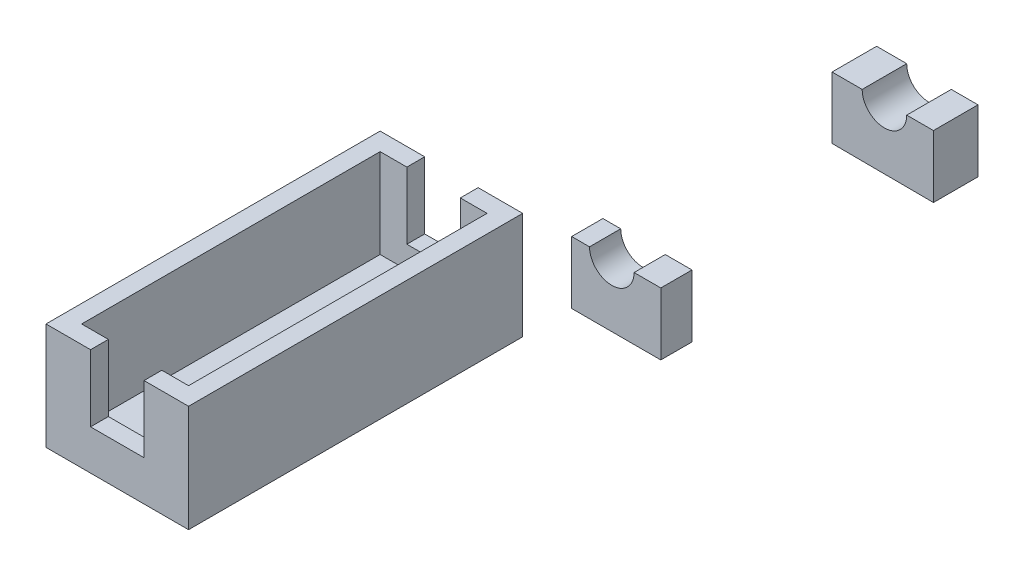
ISO-10303-21;
HEADER;
FILE_DESCRIPTION(('STEP AP214'),'2;1');
FILE_NAME('part.step','',(''),(''),'','','');
FILE_SCHEMA(('AUTOMOTIVE_DESIGN { 1 0 10303 214 1 1 1 1 }'));
ENDSEC;
DATA;
#1=APPLICATION_CONTEXT('core data for automotive mechanical design processes');
#2=APPLICATION_PROTOCOL_DEFINITION('international standard','automotive_design',2000,#1);
#3=PRODUCT_CONTEXT('',#1,'mechanical');
#4=PRODUCT('Part','Part','',(#3));
#5=PRODUCT_RELATED_PRODUCT_CATEGORY('part','',(#4));
#6=PRODUCT_DEFINITION_FORMATION('','',#4);
#7=PRODUCT_DEFINITION_CONTEXT('part definition',#1,'design');
#8=PRODUCT_DEFINITION('design','',#6,#7);
#9=PRODUCT_DEFINITION_SHAPE('','',#8);
#10=(LENGTH_UNIT() NAMED_UNIT(*) SI_UNIT(.MILLI.,.METRE.));
#11=(NAMED_UNIT(*) PLANE_ANGLE_UNIT() SI_UNIT($,.RADIAN.));
#12=(NAMED_UNIT(*) SI_UNIT($,.STERADIAN.) SOLID_ANGLE_UNIT());
#13=UNCERTAINTY_MEASURE_WITH_UNIT(LENGTH_MEASURE(1.E-05),#10,'distance_accuracy_value','');
#14=(GEOMETRIC_REPRESENTATION_CONTEXT(3) GLOBAL_UNCERTAINTY_ASSIGNED_CONTEXT((#13)) GLOBAL_UNIT_ASSIGNED_CONTEXT((#10,
#11,#12)) REPRESENTATION_CONTEXT('',''));
#15=CARTESIAN_POINT('',(0.,0.,0.));
#16=DIRECTION('',(0.,0.,1.));
#17=DIRECTION('',(1.,0.,0.));
#18=AXIS2_PLACEMENT_3D('',#15,#16,#17);
#19=CARTESIAN_POINT('',(0.,0.,-43.1));
#20=DIRECTION('',(0.,-1.,0.));
#21=DIRECTION('',(1.,0.,0.));
#22=AXIS2_PLACEMENT_3D('',#19,#20,#21);
#23=PLANE('',#22);
#24=DIRECTION('',(1.,0.,0.));
#25=VECTOR('',#24,1.);
#26=CARTESIAN_POINT('',(0.,0.,-38.1));
#27=LINE('',#26,#25);
#28=CARTESIAN_POINT('',(6.62077279727074,0.,-38.1));
#29=VERTEX_POINT('',#28);
#30=CARTESIAN_POINT('',(9.99999999999987,0.,-38.1));
#31=VERTEX_POINT('',#30);
#32=EDGE_CURVE('E130',#29,#31,#27,.T.);
#33=ORIENTED_EDGE('',*,*,#32,.T.);
#34=DIRECTION('',(0.,0.,1.));
#35=VECTOR('',#34,1.);
#36=CARTESIAN_POINT('',(9.99999999999987,0.,-43.1));
#37=LINE('',#36,#35);
#38=CARTESIAN_POINT('',(9.99999999999987,0.,-43.1));
#39=VERTEX_POINT('',#38);
#40=EDGE_CURVE('E12',#39,#31,#37,.T.);
#41=ORIENTED_EDGE('',*,*,#40,.F.);
#42=DIRECTION('',(1.,0.,0.));
#43=VECTOR('',#42,1.);
#44=CARTESIAN_POINT('',(0.,0.,-43.1));
#45=LINE('',#44,#43);
#46=CARTESIAN_POINT('',(6.62077279727074,0.,-43.1));
#47=VERTEX_POINT('',#46);
#48=EDGE_CURVE('E140',#47,#39,#45,.T.);
#49=ORIENTED_EDGE('',*,*,#48,.F.);
#50=DIRECTION('',(0.,0.,1.));
#51=VECTOR('',#50,1.);
#52=CARTESIAN_POINT('',(6.62077279727074,0.,-43.1));
#53=LINE('',#52,#51);
#54=EDGE_CURVE('E126',#47,#29,#53,.T.);
#55=ORIENTED_EDGE('',*,*,#54,.T.);
#56=EDGE_LOOP('',(#33,#41,#49,#55));
#57=FACE_BOUND('',#56,.T.);
#58=ADVANCED_FACE('F46',(#57),#23,.F.);
#59=CARTESIAN_POINT('',(12.4999999999953,1.20736753927986E-12,-43.1));
#60=DIRECTION('',(0.,0.,1.));
#61=DIRECTION('',(1.,0.,0.));
#62=AXIS2_PLACEMENT_3D('',#59,#60,#61);
#63=CYLINDRICAL_SURFACE('',#62,2.50000000000007);
#64=CARTESIAN_POINT('',(12.4999999999953,1.20736753927986E-12,-38.1));
#65=DIRECTION('',(0.,0.,-1.));
#66=DIRECTION('',(-1.,0.,0.));
#67=AXIS2_PLACEMENT_3D('',#64,#65,#66);
#68=CIRCLE('',#67,2.50000000000007);
#69=CARTESIAN_POINT('',(15.,0.,-38.1));
#70=VERTEX_POINT('',#69);
#71=EDGE_CURVE('E133',#31,#70,#68,.F.);
#72=ORIENTED_EDGE('',*,*,#71,.T.);
#73=DIRECTION('',(0.,0.,1.));
#74=VECTOR('',#73,1.);
#75=CARTESIAN_POINT('',(15.,0.,-43.1));
#76=LINE('',#75,#74);
#77=CARTESIAN_POINT('',(15.,0.,-43.1));
#78=VERTEX_POINT('',#77);
#79=EDGE_CURVE('E54',#78,#70,#76,.T.);
#80=ORIENTED_EDGE('',*,*,#79,.F.);
#81=CARTESIAN_POINT('',(12.4999999999953,1.20736753927986E-12,-43.1));
#82=DIRECTION('',(0.,0.,-1.));
#83=DIRECTION('',(-1.,0.,0.));
#84=AXIS2_PLACEMENT_3D('',#81,#82,#83);
#85=CIRCLE('',#84,2.50000000000007);
#86=EDGE_CURVE('E99',#39,#78,#85,.F.);
#87=ORIENTED_EDGE('',*,*,#86,.F.);
#88=ORIENTED_EDGE('',*,*,#40,.T.);
#89=EDGE_LOOP('',(#72,#80,#87,#88));
#90=FACE_BOUND('',#89,.T.);
#91=ADVANCED_FACE('F164',(#90),#63,.F.);
#92=CARTESIAN_POINT('',(0.,0.,-43.1));
#93=DIRECTION('',(0.,-1.,0.));
#94=DIRECTION('',(1.,0.,0.));
#95=AXIS2_PLACEMENT_3D('',#92,#93,#94);
#96=PLANE('',#95);
#97=DIRECTION('',(1.,0.,0.));
#98=VECTOR('',#97,1.);
#99=CARTESIAN_POINT('',(0.,0.,-38.1));
#100=LINE('',#99,#98);
#101=CARTESIAN_POINT('',(18.,0.,-38.1));
#102=VERTEX_POINT('',#101);
#103=EDGE_CURVE('E135',#70,#102,#100,.T.);
#104=ORIENTED_EDGE('',*,*,#103,.T.);
#105=DIRECTION('',(0.,0.,1.));
#106=VECTOR('',#105,1.);
#107=CARTESIAN_POINT('',(18.,0.,-43.1));
#108=LINE('',#107,#106);
#109=CARTESIAN_POINT('',(18.,0.,-43.1));
#110=VERTEX_POINT('',#109);
#111=EDGE_CURVE('E121',#110,#102,#108,.T.);
#112=ORIENTED_EDGE('',*,*,#111,.F.);
#113=DIRECTION('',(1.,0.,0.));
#114=VECTOR('',#113,1.);
#115=CARTESIAN_POINT('',(0.,0.,-43.1));
#116=LINE('',#115,#114);
#117=EDGE_CURVE('E112',#78,#110,#116,.T.);
#118=ORIENTED_EDGE('',*,*,#117,.F.);
#119=ORIENTED_EDGE('',*,*,#79,.T.);
#120=EDGE_LOOP('',(#104,#112,#118,#119));
#121=FACE_BOUND('',#120,.T.);
#122=ADVANCED_FACE('F146',(#121),#96,.F.);
#123=CARTESIAN_POINT('',(18.,0.,-43.1));
#124=DIRECTION('',(-1.,0.,0.));
#125=DIRECTION('',(0.,0.,1.));
#126=AXIS2_PLACEMENT_3D('',#123,#124,#125);
#127=PLANE('',#126);
#128=DIRECTION('',(0.,-1.,0.));
#129=VECTOR('',#128,1.);
#130=CARTESIAN_POINT('',(18.,0.,-38.1));
#131=LINE('',#130,#129);
#132=CARTESIAN_POINT('',(18.,-7.,-38.1));
#133=VERTEX_POINT('',#132);
#134=EDGE_CURVE('E120',#102,#133,#131,.T.);
#135=ORIENTED_EDGE('',*,*,#134,.T.);
#136=DIRECTION('',(0.,0.,1.));
#137=VECTOR('',#136,1.);
#138=CARTESIAN_POINT('',(18.,-7.,-43.1));
#139=LINE('',#138,#137);
#140=CARTESIAN_POINT('',(18.,-7.,-43.1));
#141=VERTEX_POINT('',#140);
#142=EDGE_CURVE('E117',#141,#133,#139,.T.);
#143=ORIENTED_EDGE('',*,*,#142,.F.);
#144=DIRECTION('',(0.,-1.,0.));
#145=VECTOR('',#144,1.);
#146=CARTESIAN_POINT('',(18.,0.,-43.1));
#147=LINE('',#146,#145);
#148=EDGE_CURVE('E106',#110,#141,#147,.T.);
#149=ORIENTED_EDGE('',*,*,#148,.F.);
#150=ORIENTED_EDGE('',*,*,#111,.T.);
#151=EDGE_LOOP('',(#135,#143,#149,#150));
#152=FACE_BOUND('',#151,.T.);
#153=ADVANCED_FACE('F118',(#152),#127,.F.);
#154=CARTESIAN_POINT('',(-0.0329085951559683,-6.91417080878468,-43.1));
#155=DIRECTION('',(0.00475953275125083,0.999988673359849,0.));
#156=DIRECTION('',(-0.999988673359849,0.00475953275125083,0.));
#157=AXIS2_PLACEMENT_3D('',#154,#155,#156);
#158=PLANE('',#157);
#159=DIRECTION('',(-0.999988673359849,0.00475953275125083,0.));
#160=VECTOR('',#159,1.);
#161=CARTESIAN_POINT('',(-0.0329085951559683,-6.91417080878468,-38.1));
#162=LINE('',#161,#160);
#163=CARTESIAN_POINT('',(6.62077279727074,-6.94583958198912,-38.1));
#164=VERTEX_POINT('',#163);
#165=EDGE_CURVE('E85',#133,#164,#162,.T.);
#166=ORIENTED_EDGE('',*,*,#165,.T.);
#167=DIRECTION('',(0.,0.,1.));
#168=VECTOR('',#167,1.);
#169=CARTESIAN_POINT('',(6.62077279727074,-6.94583958198912,-43.1));
#170=LINE('',#169,#168);
#171=CARTESIAN_POINT('',(6.62077279727074,-6.94583958198912,-43.1));
#172=VERTEX_POINT('',#171);
#173=EDGE_CURVE('E122',#172,#164,#170,.T.);
#174=ORIENTED_EDGE('',*,*,#173,.F.);
#175=DIRECTION('',(-0.999988673359849,0.00475953275125083,0.));
#176=VECTOR('',#175,1.);
#177=CARTESIAN_POINT('',(-0.0329085951559683,-6.91417080878468,-43.1));
#178=LINE('',#177,#176);
#179=EDGE_CURVE('E110',#141,#172,#178,.T.);
#180=ORIENTED_EDGE('',*,*,#179,.F.);
#181=ORIENTED_EDGE('',*,*,#142,.T.);
#182=EDGE_LOOP('',(#166,#174,#180,#181));
#183=FACE_BOUND('',#182,.T.);
#184=ADVANCED_FACE('F124',(#183),#158,.F.);
#185=CARTESIAN_POINT('',(6.62077279727074,0.,-43.1));
#186=DIRECTION('',(1.,0.,0.));
#187=DIRECTION('',(0.,0.,-1.));
#188=AXIS2_PLACEMENT_3D('',#185,#186,#187);
#189=PLANE('',#188);
#190=DIRECTION('',(0.,1.,0.));
#191=VECTOR('',#190,1.);
#192=CARTESIAN_POINT('',(6.62077279727074,0.,-38.1));
#193=LINE('',#192,#191);
#194=EDGE_CURVE('E91',#164,#29,#193,.T.);
#195=ORIENTED_EDGE('',*,*,#194,.T.);
#196=ORIENTED_EDGE('',*,*,#54,.F.);
#197=DIRECTION('',(0.,1.,0.));
#198=VECTOR('',#197,1.);
#199=CARTESIAN_POINT('',(6.62077279727074,0.,-43.1));
#200=LINE('',#199,#198);
#201=EDGE_CURVE('E62',#172,#47,#200,.T.);
#202=ORIENTED_EDGE('',*,*,#201,.F.);
#203=ORIENTED_EDGE('',*,*,#173,.T.);
#204=EDGE_LOOP('',(#195,#196,#202,#203));
#205=FACE_BOUND('',#204,.T.);
#206=ADVANCED_FACE('F153',(#205),#189,.F.);
#207=CARTESIAN_POINT('',(0.,0.,-43.1));
#208=DIRECTION('',(0.,0.,-1.));
#209=DIRECTION('',(-1.,0.,0.));
#210=AXIS2_PLACEMENT_3D('',#207,#208,#209);
#211=PLANE('',#210);
#212=ORIENTED_EDGE('',*,*,#48,.T.);
#213=ORIENTED_EDGE('',*,*,#86,.T.);
#214=ORIENTED_EDGE('',*,*,#117,.T.);
#215=ORIENTED_EDGE('',*,*,#148,.T.);
#216=ORIENTED_EDGE('',*,*,#179,.T.);
#217=ORIENTED_EDGE('',*,*,#201,.T.);
#218=EDGE_LOOP('',(#212,#213,#214,#215,#216,#217));
#219=FACE_BOUND('',#218,.T.);
#220=ADVANCED_FACE('F108',(#219),#211,.T.);
#221=CARTESIAN_POINT('',(0.,0.,-38.1));
#222=DIRECTION('',(0.,0.,-1.));
#223=DIRECTION('',(-1.,0.,0.));
#224=AXIS2_PLACEMENT_3D('',#221,#222,#223);
#225=PLANE('',#224);
#226=ORIENTED_EDGE('',*,*,#32,.F.);
#227=ORIENTED_EDGE('',*,*,#194,.F.);
#228=ORIENTED_EDGE('',*,*,#165,.F.);
#229=ORIENTED_EDGE('',*,*,#134,.F.);
#230=ORIENTED_EDGE('',*,*,#103,.F.);
#231=ORIENTED_EDGE('',*,*,#71,.F.);
#232=EDGE_LOOP('',(#226,#227,#228,#229,#230,#231));
#233=FACE_BOUND('',#232,.T.);
#234=ADVANCED_FACE('F149',(#233),#225,.F.);
#235=CLOSED_SHELL('',(#58,#91,#122,#153,#184,#206,#220,#234));
#236=MANIFOLD_SOLID_BREP('B2',#235);
#237=CARTESIAN_POINT('',(0.,0.,-11.));
#238=DIRECTION('',(0.,1.,0.));
#239=DIRECTION('',(-1.,0.,0.));
#240=AXIS2_PLACEMENT_3D('',#237,#238,#239);
#241=PLANE('',#240);
#242=DIRECTION('',(-1.,0.,0.));
#243=VECTOR('',#242,1.);
#244=CARTESIAN_POINT('',(0.,0.,-7.5));
#245=LINE('',#244,#243);
#246=CARTESIAN_POINT('',(10.,0.,-7.5));
#247=VERTEX_POINT('',#246);
#248=CARTESIAN_POINT('',(8.,0.,-7.5));
#249=VERTEX_POINT('',#248);
#250=EDGE_CURVE('E313',#247,#249,#245,.T.);
#251=ORIENTED_EDGE('',*,*,#250,.F.);
#252=DIRECTION('',(0.,0.,1.));
#253=VECTOR('',#252,1.);
#254=CARTESIAN_POINT('',(10.,0.,-11.));
#255=LINE('',#254,#253);
#256=CARTESIAN_POINT('',(10.,0.,-11.));
#257=VERTEX_POINT('',#256);
#258=EDGE_CURVE('E44',#257,#247,#255,.T.);
#259=ORIENTED_EDGE('',*,*,#258,.F.);
#260=DIRECTION('',(-1.,0.,0.));
#261=VECTOR('',#260,1.);
#262=CARTESIAN_POINT('',(0.,0.,-11.));
#263=LINE('',#262,#261);
#264=CARTESIAN_POINT('',(8.,0.,-11.));
#265=VERTEX_POINT('',#264);
#266=EDGE_CURVE('E325',#257,#265,#263,.T.);
#267=ORIENTED_EDGE('',*,*,#266,.T.);
#268=DIRECTION('',(0.,0.,1.));
#269=VECTOR('',#268,1.);
#270=CARTESIAN_POINT('',(8.,0.,-11.));
#271=LINE('',#270,#269);
#272=EDGE_CURVE('E247',#265,#249,#271,.T.);
#273=ORIENTED_EDGE('',*,*,#272,.T.);
#274=EDGE_LOOP('',(#251,#259,#267,#273));
#275=FACE_BOUND('',#274,.T.);
#276=ADVANCED_FACE('F231',(#275),#241,.T.);
#277=CARTESIAN_POINT('',(12.5,0.,-11.));
#278=DIRECTION('',(0.,0.,1.));
#279=DIRECTION('',(1.,0.,0.));
#280=AXIS2_PLACEMENT_3D('',#277,#278,#279);
#281=CYLINDRICAL_SURFACE('',#280,2.5);
#282=CARTESIAN_POINT('',(12.5,0.,-7.5));
#283=DIRECTION('',(0.,0.,-1.));
#284=DIRECTION('',(-1.,0.,0.));
#285=AXIS2_PLACEMENT_3D('',#282,#283,#284);
#286=CIRCLE('',#285,2.5);
#287=CARTESIAN_POINT('',(15.,0.,-7.5));
#288=VERTEX_POINT('',#287);
#289=EDGE_CURVE('E315',#247,#288,#286,.F.);
#290=ORIENTED_EDGE('',*,*,#289,.T.);
#291=DIRECTION('',(0.,0.,1.));
#292=VECTOR('',#291,1.);
#293=CARTESIAN_POINT('',(15.,0.,-11.));
#294=LINE('',#293,#292);
#295=CARTESIAN_POINT('',(15.,0.,-11.));
#296=VERTEX_POINT('',#295);
#297=EDGE_CURVE('E239',#296,#288,#294,.T.);
#298=ORIENTED_EDGE('',*,*,#297,.F.);
#299=CARTESIAN_POINT('',(12.5,0.,-11.));
#300=DIRECTION('',(0.,0.,-1.));
#301=DIRECTION('',(-1.,0.,0.));
#302=AXIS2_PLACEMENT_3D('',#299,#300,#301);
#303=CIRCLE('',#302,2.5);
#304=EDGE_CURVE('E401',#257,#296,#303,.F.);
#305=ORIENTED_EDGE('',*,*,#304,.F.);
#306=ORIENTED_EDGE('',*,*,#258,.T.);
#307=EDGE_LOOP('',(#290,#298,#305,#306));
#308=FACE_BOUND('',#307,.T.);
#309=ADVANCED_FACE('F348',(#308),#281,.F.);
#310=CARTESIAN_POINT('',(0.,0.,-11.));
#311=DIRECTION('',(0.,-1.,0.));
#312=DIRECTION('',(1.,0.,0.));
#313=AXIS2_PLACEMENT_3D('',#310,#311,#312);
#314=PLANE('',#313);
#315=DIRECTION('',(1.,0.,0.));
#316=VECTOR('',#315,1.);
#317=CARTESIAN_POINT('',(0.,0.,-7.5));
#318=LINE('',#317,#316);
#319=CARTESIAN_POINT('',(18.,0.,-7.5));
#320=VERTEX_POINT('',#319);
#321=EDGE_CURVE('E317',#288,#320,#318,.T.);
#322=ORIENTED_EDGE('',*,*,#321,.T.);
#323=DIRECTION('',(0.,0.,1.));
#324=VECTOR('',#323,1.);
#325=CARTESIAN_POINT('',(18.,0.,-11.));
#326=LINE('',#325,#324);
#327=CARTESIAN_POINT('',(18.,0.,-11.));
#328=VERTEX_POINT('',#327);
#329=EDGE_CURVE('E305',#328,#320,#326,.T.);
#330=ORIENTED_EDGE('',*,*,#329,.F.);
#331=DIRECTION('',(1.,0.,0.));
#332=VECTOR('',#331,1.);
#333=CARTESIAN_POINT('',(0.,0.,-11.));
#334=LINE('',#333,#332);
#335=EDGE_CURVE('E293',#296,#328,#334,.T.);
#336=ORIENTED_EDGE('',*,*,#335,.F.);
#337=ORIENTED_EDGE('',*,*,#297,.T.);
#338=EDGE_LOOP('',(#322,#330,#336,#337));
#339=FACE_BOUND('',#338,.T.);
#340=ADVANCED_FACE('F332',(#339),#314,.F.);
#341=CARTESIAN_POINT('',(18.,0.,-11.));
#342=DIRECTION('',(-1.,0.,0.));
#343=DIRECTION('',(0.,0.,1.));
#344=AXIS2_PLACEMENT_3D('',#341,#342,#343);
#345=PLANE('',#344);
#346=DIRECTION('',(0.,-1.,0.));
#347=VECTOR('',#346,1.);
#348=CARTESIAN_POINT('',(18.,0.,-7.5));
#349=LINE('',#348,#347);
#350=CARTESIAN_POINT('',(18.,-7.,-7.5));
#351=VERTEX_POINT('',#350);
#352=EDGE_CURVE('E302',#320,#351,#349,.T.);
#353=ORIENTED_EDGE('',*,*,#352,.T.);
#354=DIRECTION('',(0.,0.,1.));
#355=VECTOR('',#354,1.);
#356=CARTESIAN_POINT('',(18.,-7.,-11.));
#357=LINE('',#356,#355);
#358=CARTESIAN_POINT('',(18.,-7.,-11.));
#359=VERTEX_POINT('',#358);
#360=EDGE_CURVE('E299',#359,#351,#357,.T.);
#361=ORIENTED_EDGE('',*,*,#360,.F.);
#362=DIRECTION('',(0.,-1.,0.));
#363=VECTOR('',#362,1.);
#364=CARTESIAN_POINT('',(18.,0.,-11.));
#365=LINE('',#364,#363);
#366=EDGE_CURVE('E285',#328,#359,#365,.T.);
#367=ORIENTED_EDGE('',*,*,#366,.F.);
#368=ORIENTED_EDGE('',*,*,#329,.T.);
#369=EDGE_LOOP('',(#353,#361,#367,#368));
#370=FACE_BOUND('',#369,.T.);
#371=ADVANCED_FACE('F300',(#370),#345,.F.);
#372=CARTESIAN_POINT('',(0.,-7.,-11.));
#373=DIRECTION('',(0.,1.,0.));
#374=DIRECTION('',(0.,0.,1.));
#375=AXIS2_PLACEMENT_3D('',#372,#373,#374);
#376=PLANE('',#375);
#377=DIRECTION('',(-1.,0.,0.));
#378=VECTOR('',#377,1.);
#379=CARTESIAN_POINT('',(0.,-7.,-7.5));
#380=LINE('',#379,#378);
#381=CARTESIAN_POINT('',(8.,-7.,-7.5));
#382=VERTEX_POINT('',#381);
#383=EDGE_CURVE('E320',#351,#382,#380,.T.);
#384=ORIENTED_EDGE('',*,*,#383,.T.);
#385=DIRECTION('',(0.,0.,1.));
#386=VECTOR('',#385,1.);
#387=CARTESIAN_POINT('',(8.,-7.,-11.));
#388=LINE('',#387,#386);
#389=CARTESIAN_POINT('',(8.,-7.,-11.));
#390=VERTEX_POINT('',#389);
#391=EDGE_CURVE('E267',#390,#382,#388,.T.);
#392=ORIENTED_EDGE('',*,*,#391,.F.);
#393=DIRECTION('',(-1.,0.,0.));
#394=VECTOR('',#393,1.);
#395=CARTESIAN_POINT('',(0.,-7.,-11.));
#396=LINE('',#395,#394);
#397=EDGE_CURVE('E291',#359,#390,#396,.T.);
#398=ORIENTED_EDGE('',*,*,#397,.F.);
#399=ORIENTED_EDGE('',*,*,#360,.T.);
#400=EDGE_LOOP('',(#384,#392,#398,#399));
#401=FACE_BOUND('',#400,.T.);
#402=ADVANCED_FACE('F307',(#401),#376,.F.);
#403=CARTESIAN_POINT('',(8.,0.,-11.));
#404=DIRECTION('',(-1.,0.,0.));
#405=DIRECTION('',(0.,-1.,0.));
#406=AXIS2_PLACEMENT_3D('',#403,#404,#405);
#407=PLANE('',#406);
#408=DIRECTION('',(0.,-1.,0.));
#409=VECTOR('',#408,1.);
#410=CARTESIAN_POINT('',(8.,0.,-7.5));
#411=LINE('',#410,#409);
#412=EDGE_CURVE('E322',#249,#382,#411,.T.);
#413=ORIENTED_EDGE('',*,*,#412,.F.);
#414=ORIENTED_EDGE('',*,*,#272,.F.);
#415=DIRECTION('',(0.,-1.,0.));
#416=VECTOR('',#415,1.);
#417=CARTESIAN_POINT('',(8.,0.,-11.));
#418=LINE('',#417,#416);
#419=EDGE_CURVE('E308',#265,#390,#418,.T.);
#420=ORIENTED_EDGE('',*,*,#419,.T.);
#421=ORIENTED_EDGE('',*,*,#391,.T.);
#422=EDGE_LOOP('',(#413,#414,#420,#421));
#423=FACE_BOUND('',#422,.T.);
#424=ADVANCED_FACE('F337',(#423),#407,.T.);
#425=CARTESIAN_POINT('',(0.,0.,-11.));
#426=DIRECTION('',(0.,0.,-1.));
#427=DIRECTION('',(-1.,0.,0.));
#428=AXIS2_PLACEMENT_3D('',#425,#426,#427);
#429=PLANE('',#428);
#430=ORIENTED_EDGE('',*,*,#266,.F.);
#431=ORIENTED_EDGE('',*,*,#304,.T.);
#432=ORIENTED_EDGE('',*,*,#335,.T.);
#433=ORIENTED_EDGE('',*,*,#366,.T.);
#434=ORIENTED_EDGE('',*,*,#397,.T.);
#435=ORIENTED_EDGE('',*,*,#419,.F.);
#436=EDGE_LOOP('',(#430,#431,#432,#433,#434,#435));
#437=FACE_BOUND('',#436,.T.);
#438=ADVANCED_FACE('F288',(#437),#429,.T.);
#439=CARTESIAN_POINT('',(0.,0.,-7.5));
#440=DIRECTION('',(0.,0.,-1.));
#441=DIRECTION('',(-1.,0.,0.));
#442=AXIS2_PLACEMENT_3D('',#439,#440,#441);
#443=PLANE('',#442);
#444=ORIENTED_EDGE('',*,*,#250,.T.);
#445=ORIENTED_EDGE('',*,*,#412,.T.);
#446=ORIENTED_EDGE('',*,*,#383,.F.);
#447=ORIENTED_EDGE('',*,*,#352,.F.);
#448=ORIENTED_EDGE('',*,*,#321,.F.);
#449=ORIENTED_EDGE('',*,*,#289,.F.);
#450=EDGE_LOOP('',(#444,#445,#446,#447,#448,#449));
#451=FACE_BOUND('',#450,.T.);
#452=ADVANCED_FACE('F336',(#451),#443,.F.);
#453=CLOSED_SHELL('',(#276,#309,#340,#371,#402,#424,#438,#452));
#454=MANIFOLD_SOLID_BREP('B6',#453);
#455=CARTESIAN_POINT('',(-6.,0.,33.5));
#456=DIRECTION('',(1.,0.,0.));
#457=DIRECTION('',(0.,0.,-1.));
#458=AXIS2_PLACEMENT_3D('',#455,#456,#457);
#459=PLANE('',#458);
#460=DIRECTION('',(0.,-1.,0.));
#461=VECTOR('',#460,1.);
#462=CARTESIAN_POINT('',(-6.,0.,0.));
#463=LINE('',#462,#461);
#464=CARTESIAN_POINT('',(-6.,5.,0.));
#465=VERTEX_POINT('',#464);
#466=CARTESIAN_POINT('',(-6.,-5.,0.));
#467=VERTEX_POINT('',#466);
#468=EDGE_CURVE('E591',#465,#467,#463,.T.);
#469=ORIENTED_EDGE('',*,*,#468,.F.);
#470=DIRECTION('',(0.,0.,-1.));
#471=VECTOR('',#470,1.);
#472=CARTESIAN_POINT('',(-6.,5.,33.5));
#473=LINE('',#472,#471);
#474=CARTESIAN_POINT('',(-6.,5.,33.5));
#475=VERTEX_POINT('',#474);
#476=EDGE_CURVE('E229',#475,#465,#473,.T.);
#477=ORIENTED_EDGE('',*,*,#476,.F.);
#478=DIRECTION('',(0.,-1.,0.));
#479=VECTOR('',#478,1.);
#480=CARTESIAN_POINT('',(-6.,0.,33.5));
#481=LINE('',#480,#479);
#482=CARTESIAN_POINT('',(-6.,-5.,33.5));
#483=VERTEX_POINT('',#482);
#484=EDGE_CURVE('E599',#475,#483,#481,.T.);
#485=ORIENTED_EDGE('',*,*,#484,.T.);
#486=DIRECTION('',(0.,0.,-1.));
#487=VECTOR('',#486,1.);
#488=CARTESIAN_POINT('',(-6.,-5.,33.5));
#489=LINE('',#488,#487);
#490=EDGE_CURVE('E439',#483,#467,#489,.T.);
#491=ORIENTED_EDGE('',*,*,#490,.T.);
#492=EDGE_LOOP('',(#469,#477,#485,#491));
#493=FACE_BOUND('',#492,.T.);
#494=ADVANCED_FACE('F406',(#493),#459,.T.);
#495=CARTESIAN_POINT('',(0.,5.,33.5));
#496=DIRECTION('',(0.,1.,0.));
#497=DIRECTION('',(0.,0.,1.));
#498=AXIS2_PLACEMENT_3D('',#495,#496,#497);
#499=PLANE('',#498);
#500=ORIENTED_EDGE('',*,*,#476,.T.);
#501=DIRECTION('',(-1.,0.,0.));
#502=VECTOR('',#501,1.);
#503=CARTESIAN_POINT('',(0.,5.,0.));
#504=LINE('',#503,#502);
#505=CARTESIAN_POINT('',(-3.,5.,0.));
#506=VERTEX_POINT('',#505);
#507=EDGE_CURVE('E548',#506,#465,#504,.T.);
#508=ORIENTED_EDGE('',*,*,#507,.F.);
#509=DIRECTION('',(0.,0.,1.));
#510=VECTOR('',#509,1.);
#511=CARTESIAN_POINT('',(-3.,5.,-2.));
#512=LINE('',#511,#510);
#513=CARTESIAN_POINT('',(-3.,5.,-2.));
#514=VERTEX_POINT('',#513);
#515=EDGE_CURVE('E589',#514,#506,#512,.T.);
#516=ORIENTED_EDGE('',*,*,#515,.F.);
#517=DIRECTION('',(-1.,0.,0.));
#518=VECTOR('',#517,1.);
#519=CARTESIAN_POINT('',(0.,5.,-2.));
#520=LINE('',#519,#518);
#521=CARTESIAN_POINT('',(-8.,5.,-2.));
#522=VERTEX_POINT('',#521);
#523=EDGE_CURVE('E557',#514,#522,#520,.T.);
#524=ORIENTED_EDGE('',*,*,#523,.T.);
#525=DIRECTION('',(0.,0.,-1.));
#526=VECTOR('',#525,1.);
#527=CARTESIAN_POINT('',(-8.,5.,33.5));
#528=LINE('',#527,#526);
#529=CARTESIAN_POINT('',(-8.,5.,35.5));
#530=VERTEX_POINT('',#529);
#531=EDGE_CURVE('E414',#530,#522,#528,.T.);
#532=ORIENTED_EDGE('',*,*,#531,.F.);
#533=DIRECTION('',(1.,0.,0.));
#534=VECTOR('',#533,1.);
#535=CARTESIAN_POINT('',(0.,5.,35.5));
#536=LINE('',#535,#534);
#537=CARTESIAN_POINT('',(-3.,5.,35.5));
#538=VERTEX_POINT('',#537);
#539=EDGE_CURVE('E667',#530,#538,#536,.T.);
#540=ORIENTED_EDGE('',*,*,#539,.T.);
#541=DIRECTION('',(0.,0.,-1.));
#542=VECTOR('',#541,1.);
#543=CARTESIAN_POINT('',(-3.,5.,35.5));
#544=LINE('',#543,#542);
#545=CARTESIAN_POINT('',(-3.,5.,33.5));
#546=VERTEX_POINT('',#545);
#547=EDGE_CURVE('E553',#538,#546,#544,.T.);
#548=ORIENTED_EDGE('',*,*,#547,.T.);
#549=DIRECTION('',(1.,0.,0.));
#550=VECTOR('',#549,1.);
#551=CARTESIAN_POINT('',(0.,5.,33.5));
#552=LINE('',#551,#550);
#553=EDGE_CURVE('E679',#475,#546,#552,.T.);
#554=ORIENTED_EDGE('',*,*,#553,.F.);
#555=EDGE_LOOP('',(#500,#508,#516,#524,#532,#540,#548,#554));
#556=FACE_BOUND('',#555,.T.);
#557=ADVANCED_FACE('F636',(#556),#499,.T.);
#558=CARTESIAN_POINT('',(-8.,0.,33.5));
#559=DIRECTION('',(-1.,0.,0.));
#560=DIRECTION('',(0.,0.,1.));
#561=AXIS2_PLACEMENT_3D('',#558,#559,#560);
#562=PLANE('',#561);
#563=ORIENTED_EDGE('',*,*,#531,.T.);
#564=DIRECTION('',(0.,1.,0.));
#565=VECTOR('',#564,1.);
#566=CARTESIAN_POINT('',(-8.,0.,-2.));
#567=LINE('',#566,#565);
#568=CARTESIAN_POINT('',(-8.,-7.,-2.));
#569=VERTEX_POINT('',#568);
#570=EDGE_CURVE('E560',#569,#522,#567,.T.);
#571=ORIENTED_EDGE('',*,*,#570,.F.);
#572=DIRECTION('',(0.,0.,-1.));
#573=VECTOR('',#572,1.);
#574=CARTESIAN_POINT('',(-8.,-7.,33.5));
#575=LINE('',#574,#573);
#576=CARTESIAN_POINT('',(-8.,-7.,35.5));
#577=VERTEX_POINT('',#576);
#578=EDGE_CURVE('E621',#577,#569,#575,.T.);
#579=ORIENTED_EDGE('',*,*,#578,.F.);
#580=DIRECTION('',(0.,-1.,0.));
#581=VECTOR('',#580,1.);
#582=CARTESIAN_POINT('',(-8.,0.,35.5));
#583=LINE('',#582,#581);
#584=EDGE_CURVE('E627',#530,#577,#583,.T.);
#585=ORIENTED_EDGE('',*,*,#584,.F.);
#586=EDGE_LOOP('',(#563,#571,#579,#585));
#587=FACE_BOUND('',#586,.T.);
#588=ADVANCED_FACE('F625',(#587),#562,.T.);
#589=CARTESIAN_POINT('',(0.,-7.,33.5));
#590=DIRECTION('',(0.,-1.,0.));
#591=DIRECTION('',(1.,0.,0.));
#592=AXIS2_PLACEMENT_3D('',#589,#590,#591);
#593=PLANE('',#592);
#594=ORIENTED_EDGE('',*,*,#578,.T.);
#595=DIRECTION('',(-1.,0.,0.));
#596=VECTOR('',#595,1.);
#597=CARTESIAN_POINT('',(0.,-7.,-2.));
#598=LINE('',#597,#596);
#599=CARTESIAN_POINT('',(8.,-7.,-2.));
#600=VERTEX_POINT('',#599);
#601=EDGE_CURVE('E564',#600,#569,#598,.T.);
#602=ORIENTED_EDGE('',*,*,#601,.F.);
#603=DIRECTION('',(0.,0.,-1.));
#604=VECTOR('',#603,1.);
#605=CARTESIAN_POINT('',(8.,-7.,33.5));
#606=LINE('',#605,#604);
#607=CARTESIAN_POINT('',(8.,-7.,35.5));
#608=VERTEX_POINT('',#607);
#609=EDGE_CURVE('E619',#608,#600,#606,.T.);
#610=ORIENTED_EDGE('',*,*,#609,.F.);
#611=DIRECTION('',(1.,0.,0.));
#612=VECTOR('',#611,1.);
#613=CARTESIAN_POINT('',(0.,-7.,35.5));
#614=LINE('',#613,#612);
#615=EDGE_CURVE('E664',#577,#608,#614,.T.);
#616=ORIENTED_EDGE('',*,*,#615,.F.);
#617=EDGE_LOOP('',(#594,#602,#610,#616));
#618=FACE_BOUND('',#617,.T.);
#619=ADVANCED_FACE('F663',(#618),#593,.T.);
#620=CARTESIAN_POINT('',(8.,0.,33.5));
#621=DIRECTION('',(1.,0.,0.));
#622=DIRECTION('',(0.,1.,0.));
#623=AXIS2_PLACEMENT_3D('',#620,#621,#622);
#624=PLANE('',#623);
#625=ORIENTED_EDGE('',*,*,#609,.T.);
#626=DIRECTION('',(0.,-1.,0.));
#627=VECTOR('',#626,1.);
#628=CARTESIAN_POINT('',(8.,0.,-2.));
#629=LINE('',#628,#627);
#630=CARTESIAN_POINT('',(8.,5.,-2.));
#631=VERTEX_POINT('',#630);
#632=EDGE_CURVE('E567',#631,#600,#629,.T.);
#633=ORIENTED_EDGE('',*,*,#632,.F.);
#634=DIRECTION('',(0.,0.,-1.));
#635=VECTOR('',#634,1.);
#636=CARTESIAN_POINT('',(8.,5.,33.5));
#637=LINE('',#636,#635);
#638=CARTESIAN_POINT('',(8.,5.,35.5));
#639=VERTEX_POINT('',#638);
#640=EDGE_CURVE('E617',#639,#631,#637,.T.);
#641=ORIENTED_EDGE('',*,*,#640,.F.);
#642=DIRECTION('',(0.,1.,0.));
#643=VECTOR('',#642,1.);
#644=CARTESIAN_POINT('',(8.,0.,35.5));
#645=LINE('',#644,#643);
#646=EDGE_CURVE('E659',#608,#639,#645,.T.);
#647=ORIENTED_EDGE('',*,*,#646,.F.);
#648=EDGE_LOOP('',(#625,#633,#641,#647));
#649=FACE_BOUND('',#648,.T.);
#650=ADVANCED_FACE('F657',(#649),#624,.T.);
#651=CARTESIAN_POINT('',(0.,5.,33.5));
#652=DIRECTION('',(0.,1.,0.));
#653=DIRECTION('',(0.,0.,1.));
#654=AXIS2_PLACEMENT_3D('',#651,#652,#653);
#655=PLANE('',#654);
#656=ORIENTED_EDGE('',*,*,#640,.T.);
#657=DIRECTION('',(1.,0.,0.));
#658=VECTOR('',#657,1.);
#659=CARTESIAN_POINT('',(0.,5.,-2.));
#660=LINE('',#659,#658);
#661=CARTESIAN_POINT('',(3.,5.,-2.));
#662=VERTEX_POINT('',#661);
#663=EDGE_CURVE('E570',#662,#631,#660,.T.);
#664=ORIENTED_EDGE('',*,*,#663,.F.);
#665=DIRECTION('',(0.,0.,1.));
#666=VECTOR('',#665,1.);
#667=CARTESIAN_POINT('',(3.,5.,-2.));
#668=LINE('',#667,#666);
#669=CARTESIAN_POINT('',(3.,5.,0.));
#670=VERTEX_POINT('',#669);
#671=EDGE_CURVE('E579',#662,#670,#668,.T.);
#672=ORIENTED_EDGE('',*,*,#671,.T.);
#673=DIRECTION('',(1.,0.,0.));
#674=VECTOR('',#673,1.);
#675=CARTESIAN_POINT('',(0.,5.,0.));
#676=LINE('',#675,#674);
#677=CARTESIAN_POINT('',(6.,5.,0.));
#678=VERTEX_POINT('',#677);
#679=EDGE_CURVE('E551',#670,#678,#676,.T.);
#680=ORIENTED_EDGE('',*,*,#679,.T.);
#681=DIRECTION('',(0.,0.,-1.));
#682=VECTOR('',#681,1.);
#683=CARTESIAN_POINT('',(6.,5.,33.5));
#684=LINE('',#683,#682);
#685=CARTESIAN_POINT('',(6.,5.,33.5));
#686=VERTEX_POINT('',#685);
#687=EDGE_CURVE('E615',#686,#678,#684,.T.);
#688=ORIENTED_EDGE('',*,*,#687,.F.);
#689=DIRECTION('',(-1.,0.,0.));
#690=VECTOR('',#689,1.);
#691=CARTESIAN_POINT('',(0.,5.,33.5));
#692=LINE('',#691,#690);
#693=CARTESIAN_POINT('',(3.,5.,33.5));
#694=VERTEX_POINT('',#693);
#695=EDGE_CURVE('E543',#686,#694,#692,.T.);
#696=ORIENTED_EDGE('',*,*,#695,.T.);
#697=DIRECTION('',(0.,0.,-1.));
#698=VECTOR('',#697,1.);
#699=CARTESIAN_POINT('',(3.,5.,35.5));
#700=LINE('',#699,#698);
#701=CARTESIAN_POINT('',(3.,5.,35.5));
#702=VERTEX_POINT('',#701);
#703=EDGE_CURVE('E672',#702,#694,#700,.T.);
#704=ORIENTED_EDGE('',*,*,#703,.F.);
#705=DIRECTION('',(-1.,0.,0.));
#706=VECTOR('',#705,1.);
#707=CARTESIAN_POINT('',(0.,5.,35.5));
#708=LINE('',#707,#706);
#709=EDGE_CURVE('E539',#639,#702,#708,.T.);
#710=ORIENTED_EDGE('',*,*,#709,.F.);
#711=EDGE_LOOP('',(#656,#664,#672,#680,#688,#696,#704,#710));
#712=FACE_BOUND('',#711,.T.);
#713=ADVANCED_FACE('F654',(#712),#655,.T.);
#714=CARTESIAN_POINT('',(6.,0.,33.5));
#715=DIRECTION('',(-1.,0.,0.));
#716=DIRECTION('',(0.,0.,1.));
#717=AXIS2_PLACEMENT_3D('',#714,#715,#716);
#718=PLANE('',#717);
#719=DIRECTION('',(0.,1.,0.));
#720=VECTOR('',#719,1.);
#721=CARTESIAN_POINT('',(6.,0.,0.));
#722=LINE('',#721,#720);
#723=CARTESIAN_POINT('',(6.,-5.,0.));
#724=VERTEX_POINT('',#723);
#725=EDGE_CURVE('E609',#724,#678,#722,.T.);
#726=ORIENTED_EDGE('',*,*,#725,.F.);
#727=DIRECTION('',(0.,0.,-1.));
#728=VECTOR('',#727,1.);
#729=CARTESIAN_POINT('',(6.,-5.,33.5));
#730=LINE('',#729,#728);
#731=CARTESIAN_POINT('',(6.,-5.,33.5));
#732=VERTEX_POINT('',#731);
#733=EDGE_CURVE('E422',#732,#724,#730,.T.);
#734=ORIENTED_EDGE('',*,*,#733,.F.);
#735=DIRECTION('',(0.,1.,0.));
#736=VECTOR('',#735,1.);
#737=CARTESIAN_POINT('',(6.,0.,33.5));
#738=LINE('',#737,#736);
#739=EDGE_CURVE('E601',#732,#686,#738,.T.);
#740=ORIENTED_EDGE('',*,*,#739,.T.);
#741=ORIENTED_EDGE('',*,*,#687,.T.);
#742=EDGE_LOOP('',(#726,#734,#740,#741));
#743=FACE_BOUND('',#742,.T.);
#744=ADVANCED_FACE('F695',(#743),#718,.T.);
#745=CARTESIAN_POINT('',(0.,-5.,33.5));
#746=DIRECTION('',(0.,-1.,0.));
#747=DIRECTION('',(0.,0.,-1.));
#748=AXIS2_PLACEMENT_3D('',#745,#746,#747);
#749=PLANE('',#748);
#750=DIRECTION('',(-1.,0.,0.));
#751=VECTOR('',#750,1.);
#752=CARTESIAN_POINT('',(0.,-5.,0.));
#753=LINE('',#752,#751);
#754=EDGE_CURVE('E602',#724,#467,#753,.T.);
#755=ORIENTED_EDGE('',*,*,#754,.T.);
#756=ORIENTED_EDGE('',*,*,#490,.F.);
#757=DIRECTION('',(-1.,0.,0.));
#758=VECTOR('',#757,1.);
#759=CARTESIAN_POINT('',(0.,-5.,33.5));
#760=LINE('',#759,#758);
#761=EDGE_CURVE('E604',#732,#483,#760,.T.);
#762=ORIENTED_EDGE('',*,*,#761,.F.);
#763=ORIENTED_EDGE('',*,*,#733,.T.);
#764=EDGE_LOOP('',(#755,#756,#762,#763));
#765=FACE_BOUND('',#764,.T.);
#766=ADVANCED_FACE('F690',(#765),#749,.F.);
#767=CARTESIAN_POINT('',(-3.,0.,-2.));
#768=DIRECTION('',(1.,0.,0.));
#769=DIRECTION('',(0.,0.,-1.));
#770=AXIS2_PLACEMENT_3D('',#767,#768,#769);
#771=PLANE('',#770);
#772=DIRECTION('',(0.,1.,0.));
#773=VECTOR('',#772,1.);
#774=CARTESIAN_POINT('',(-3.,0.,0.));
#775=LINE('',#774,#773);
#776=CARTESIAN_POINT('',(-3.,-2.5,0.));
#777=VERTEX_POINT('',#776);
#778=EDGE_CURVE('E561',#777,#506,#775,.T.);
#779=ORIENTED_EDGE('',*,*,#778,.F.);
#780=DIRECTION('',(0.,0.,1.));
#781=VECTOR('',#780,1.);
#782=CARTESIAN_POINT('',(-3.,-2.5,-2.));
#783=LINE('',#782,#781);
#784=CARTESIAN_POINT('',(-3.,-2.5,-2.));
#785=VERTEX_POINT('',#784);
#786=EDGE_CURVE('E592',#785,#777,#783,.T.);
#787=ORIENTED_EDGE('',*,*,#786,.F.);
#788=DIRECTION('',(0.,1.,0.));
#789=VECTOR('',#788,1.);
#790=CARTESIAN_POINT('',(-3.,0.,-2.));
#791=LINE('',#790,#789);
#792=EDGE_CURVE('E577',#785,#514,#791,.T.);
#793=ORIENTED_EDGE('',*,*,#792,.T.);
#794=ORIENTED_EDGE('',*,*,#515,.T.);
#795=EDGE_LOOP('',(#779,#787,#793,#794));
#796=FACE_BOUND('',#795,.T.);
#797=ADVANCED_FACE('F640',(#796),#771,.T.);
#798=CARTESIAN_POINT('',(0.,-2.5,-2.));
#799=DIRECTION('',(0.,-1.,0.));
#800=DIRECTION('',(0.,0.,-1.));
#801=AXIS2_PLACEMENT_3D('',#798,#799,#800);
#802=PLANE('',#801);
#803=DIRECTION('',(1.,0.,0.));
#804=VECTOR('',#803,1.);
#805=CARTESIAN_POINT('',(0.,-2.5,0.));
#806=LINE('',#805,#804);
#807=CARTESIAN_POINT('',(3.,-2.5,0.));
#808=VERTEX_POINT('',#807);
#809=EDGE_CURVE('E585',#777,#808,#806,.T.);
#810=ORIENTED_EDGE('',*,*,#809,.T.);
#811=DIRECTION('',(0.,0.,1.));
#812=VECTOR('',#811,1.);
#813=CARTESIAN_POINT('',(3.,-2.5,-2.));
#814=LINE('',#813,#812);
#815=CARTESIAN_POINT('',(3.,-2.5,-2.));
#816=VERTEX_POINT('',#815);
#817=EDGE_CURVE('E594',#816,#808,#814,.T.);
#818=ORIENTED_EDGE('',*,*,#817,.F.);
#819=DIRECTION('',(1.,0.,0.));
#820=VECTOR('',#819,1.);
#821=CARTESIAN_POINT('',(0.,-2.5,-2.));
#822=LINE('',#821,#820);
#823=EDGE_CURVE('E575',#785,#816,#822,.T.);
#824=ORIENTED_EDGE('',*,*,#823,.F.);
#825=ORIENTED_EDGE('',*,*,#786,.T.);
#826=EDGE_LOOP('',(#810,#818,#824,#825));
#827=FACE_BOUND('',#826,.T.);
#828=ADVANCED_FACE('F646',(#827),#802,.F.);
#829=CARTESIAN_POINT('',(3.,0.,-2.));
#830=DIRECTION('',(1.,0.,0.));
#831=DIRECTION('',(0.,0.,-1.));
#832=AXIS2_PLACEMENT_3D('',#829,#830,#831);
#833=PLANE('',#832);
#834=DIRECTION('',(0.,1.,0.));
#835=VECTOR('',#834,1.);
#836=CARTESIAN_POINT('',(3.,0.,0.));
#837=LINE('',#836,#835);
#838=EDGE_CURVE('E583',#808,#670,#837,.T.);
#839=ORIENTED_EDGE('',*,*,#838,.T.);
#840=ORIENTED_EDGE('',*,*,#671,.F.);
#841=DIRECTION('',(0.,1.,0.));
#842=VECTOR('',#841,1.);
#843=CARTESIAN_POINT('',(3.,0.,-2.));
#844=LINE('',#843,#842);
#845=EDGE_CURVE('E573',#816,#662,#844,.T.);
#846=ORIENTED_EDGE('',*,*,#845,.F.);
#847=ORIENTED_EDGE('',*,*,#817,.T.);
#848=EDGE_LOOP('',(#839,#840,#846,#847));
#849=FACE_BOUND('',#848,.T.);
#850=ADVANCED_FACE('F650',(#849),#833,.F.);
#851=CARTESIAN_POINT('',(0.,0.,-2.));
#852=DIRECTION('',(0.,0.,1.));
#853=DIRECTION('',(1.,0.,0.));
#854=AXIS2_PLACEMENT_3D('',#851,#852,#853);
#855=PLANE('',#854);
#856=ORIENTED_EDGE('',*,*,#523,.F.);
#857=ORIENTED_EDGE('',*,*,#792,.F.);
#858=ORIENTED_EDGE('',*,*,#823,.T.);
#859=ORIENTED_EDGE('',*,*,#845,.T.);
#860=ORIENTED_EDGE('',*,*,#663,.T.);
#861=ORIENTED_EDGE('',*,*,#632,.T.);
#862=ORIENTED_EDGE('',*,*,#601,.T.);
#863=ORIENTED_EDGE('',*,*,#570,.T.);
#864=EDGE_LOOP('',(#856,#857,#858,#859,#860,#861,#862,#863));
#865=FACE_BOUND('',#864,.T.);
#866=ADVANCED_FACE('F633',(#865),#855,.F.);
#867=CARTESIAN_POINT('',(0.,0.,0.));
#868=DIRECTION('',(0.,0.,1.));
#869=DIRECTION('',(1.,0.,0.));
#870=AXIS2_PLACEMENT_3D('',#867,#868,#869);
#871=PLANE('',#870);
#872=ORIENTED_EDGE('',*,*,#507,.T.);
#873=ORIENTED_EDGE('',*,*,#468,.T.);
#874=ORIENTED_EDGE('',*,*,#754,.F.);
#875=ORIENTED_EDGE('',*,*,#725,.T.);
#876=ORIENTED_EDGE('',*,*,#679,.F.);
#877=ORIENTED_EDGE('',*,*,#838,.F.);
#878=ORIENTED_EDGE('',*,*,#809,.F.);
#879=ORIENTED_EDGE('',*,*,#778,.T.);
#880=EDGE_LOOP('',(#872,#873,#874,#875,#876,#877,#878,#879));
#881=FACE_BOUND('',#880,.T.);
#882=ADVANCED_FACE('F693',(#881),#871,.T.);
#883=CARTESIAN_POINT('',(0.,0.,33.5));
#884=DIRECTION('',(0.,0.,-1.));
#885=DIRECTION('',(-1.,0.,0.));
#886=AXIS2_PLACEMENT_3D('',#883,#884,#885);
#887=PLANE('',#886);
#888=ORIENTED_EDGE('',*,*,#484,.F.);
#889=ORIENTED_EDGE('',*,*,#553,.T.);
#890=DIRECTION('',(0.,-1.,0.));
#891=VECTOR('',#890,1.);
#892=CARTESIAN_POINT('',(-3.,0.,33.5));
#893=LINE('',#892,#891);
#894=CARTESIAN_POINT('',(-3.,-2.5,33.5));
#895=VERTEX_POINT('',#894);
#896=EDGE_CURVE('E676',#546,#895,#893,.T.);
#897=ORIENTED_EDGE('',*,*,#896,.T.);
#898=DIRECTION('',(-1.,0.,0.));
#899=VECTOR('',#898,1.);
#900=CARTESIAN_POINT('',(0.,-2.5,33.5));
#901=LINE('',#900,#899);
#902=CARTESIAN_POINT('',(3.,-2.5,33.5));
#903=VERTEX_POINT('',#902);
#904=EDGE_CURVE('E674',#903,#895,#901,.T.);
#905=ORIENTED_EDGE('',*,*,#904,.F.);
#906=DIRECTION('',(0.,-1.,0.));
#907=VECTOR('',#906,1.);
#908=CARTESIAN_POINT('',(3.,0.,33.5));
#909=LINE('',#908,#907);
#910=EDGE_CURVE('E547',#694,#903,#909,.T.);
#911=ORIENTED_EDGE('',*,*,#910,.F.);
#912=ORIENTED_EDGE('',*,*,#695,.F.);
#913=ORIENTED_EDGE('',*,*,#739,.F.);
#914=ORIENTED_EDGE('',*,*,#761,.T.);
#915=EDGE_LOOP('',(#888,#889,#897,#905,#911,#912,#913,#914));
#916=FACE_BOUND('',#915,.T.);
#917=ADVANCED_FACE('F688',(#916),#887,.T.);
#918=CARTESIAN_POINT('',(3.,0.,35.5));
#919=DIRECTION('',(1.,0.,0.));
#920=DIRECTION('',(0.,0.,-1.));
#921=AXIS2_PLACEMENT_3D('',#918,#919,#920);
#922=PLANE('',#921);
#923=ORIENTED_EDGE('',*,*,#910,.T.);
#924=DIRECTION('',(0.,0.,-1.));
#925=VECTOR('',#924,1.);
#926=CARTESIAN_POINT('',(3.,-2.5,35.5));
#927=LINE('',#926,#925);
#928=CARTESIAN_POINT('',(3.,-2.5,35.5));
#929=VERTEX_POINT('',#928);
#930=EDGE_CURVE('E526',#929,#903,#927,.T.);
#931=ORIENTED_EDGE('',*,*,#930,.F.);
#932=DIRECTION('',(0.,-1.,0.));
#933=VECTOR('',#932,1.);
#934=CARTESIAN_POINT('',(3.,0.,35.5));
#935=LINE('',#934,#933);
#936=EDGE_CURVE('E533',#702,#929,#935,.T.);
#937=ORIENTED_EDGE('',*,*,#936,.F.);
#938=ORIENTED_EDGE('',*,*,#703,.T.);
#939=EDGE_LOOP('',(#923,#931,#937,#938));
#940=FACE_BOUND('',#939,.T.);
#941=ADVANCED_FACE('F545',(#940),#922,.F.);
#942=CARTESIAN_POINT('',(0.,-2.5,35.5));
#943=DIRECTION('',(0.,-1.,0.));
#944=DIRECTION('',(0.,0.,-1.));
#945=AXIS2_PLACEMENT_3D('',#942,#943,#944);
#946=PLANE('',#945);
#947=ORIENTED_EDGE('',*,*,#904,.T.);
#948=DIRECTION('',(0.,0.,-1.));
#949=VECTOR('',#948,1.);
#950=CARTESIAN_POINT('',(-3.,-2.5,35.5));
#951=LINE('',#950,#949);
#952=CARTESIAN_POINT('',(-3.,-2.5,35.5));
#953=VERTEX_POINT('',#952);
#954=EDGE_CURVE('E528',#953,#895,#951,.T.);
#955=ORIENTED_EDGE('',*,*,#954,.F.);
#956=DIRECTION('',(-1.,0.,0.));
#957=VECTOR('',#956,1.);
#958=CARTESIAN_POINT('',(0.,-2.5,35.5));
#959=LINE('',#958,#957);
#960=EDGE_CURVE('E521',#929,#953,#959,.T.);
#961=ORIENTED_EDGE('',*,*,#960,.F.);
#962=ORIENTED_EDGE('',*,*,#930,.T.);
#963=EDGE_LOOP('',(#947,#955,#961,#962));
#964=FACE_BOUND('',#963,.T.);
#965=ADVANCED_FACE('F524',(#964),#946,.F.);
#966=CARTESIAN_POINT('',(-3.,0.,35.5));
#967=DIRECTION('',(1.,0.,0.));
#968=DIRECTION('',(0.,0.,-1.));
#969=AXIS2_PLACEMENT_3D('',#966,#967,#968);
#970=PLANE('',#969);
#971=ORIENTED_EDGE('',*,*,#896,.F.);
#972=ORIENTED_EDGE('',*,*,#547,.F.);
#973=DIRECTION('',(0.,-1.,0.));
#974=VECTOR('',#973,1.);
#975=CARTESIAN_POINT('',(-3.,0.,35.5));
#976=LINE('',#975,#974);
#977=EDGE_CURVE('E532',#538,#953,#976,.T.);
#978=ORIENTED_EDGE('',*,*,#977,.T.);
#979=ORIENTED_EDGE('',*,*,#954,.T.);
#980=EDGE_LOOP('',(#971,#972,#978,#979));
#981=FACE_BOUND('',#980,.T.);
#982=ADVANCED_FACE('F686',(#981),#970,.T.);
#983=CARTESIAN_POINT('',(0.,0.,35.5));
#984=DIRECTION('',(0.,0.,-1.));
#985=DIRECTION('',(-1.,0.,0.));
#986=AXIS2_PLACEMENT_3D('',#983,#984,#985);
#987=PLANE('',#986);
#988=ORIENTED_EDGE('',*,*,#936,.T.);
#989=ORIENTED_EDGE('',*,*,#960,.T.);
#990=ORIENTED_EDGE('',*,*,#977,.F.);
#991=ORIENTED_EDGE('',*,*,#539,.F.);
#992=ORIENTED_EDGE('',*,*,#584,.T.);
#993=ORIENTED_EDGE('',*,*,#615,.T.);
#994=ORIENTED_EDGE('',*,*,#646,.T.);
#995=ORIENTED_EDGE('',*,*,#709,.T.);
#996=EDGE_LOOP('',(#988,#989,#990,#991,#992,#993,#994,#995));
#997=FACE_BOUND('',#996,.T.);
#998=ADVANCED_FACE('F536',(#997),#987,.F.);
#999=CLOSED_SHELL('',(#494,#557,#588,#619,#650,#713,#744,#766,#797,#828,#850,#866,#882,#917,
#941,#965,#982,#998));
#1000=MANIFOLD_SOLID_BREP('B38',#999);
#1001=ADVANCED_BREP_SHAPE_REPRESENTATION('',(#18,#236,#454,#1000),#14);
#1002=SHAPE_DEFINITION_REPRESENTATION(#9,#1001);
ENDSEC;
END-ISO-10303-21;
